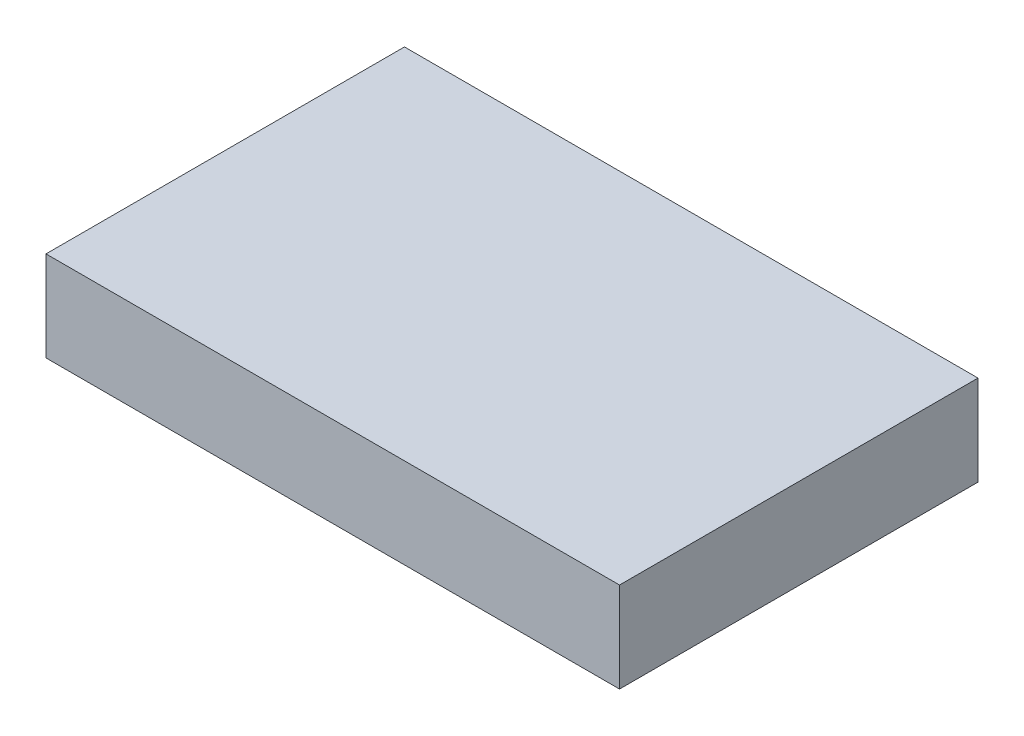
ISO-10303-21;
HEADER;
FILE_DESCRIPTION(('STEP AP214'),'2;1');
FILE_NAME('part.step','',(''),(''),'','','');
FILE_SCHEMA(('AUTOMOTIVE_DESIGN { 1 0 10303 214 1 1 1 1 }'));
ENDSEC;
DATA;
#1=APPLICATION_CONTEXT('core data for automotive mechanical design processes');
#2=APPLICATION_PROTOCOL_DEFINITION('international standard','automotive_design',2000,#1);
#3=PRODUCT_CONTEXT('',#1,'mechanical');
#4=PRODUCT('Part','Part','',(#3));
#5=PRODUCT_RELATED_PRODUCT_CATEGORY('part','',(#4));
#6=PRODUCT_DEFINITION_FORMATION('','',#4);
#7=PRODUCT_DEFINITION_CONTEXT('part definition',#1,'design');
#8=PRODUCT_DEFINITION('design','',#6,#7);
#9=PRODUCT_DEFINITION_SHAPE('','',#8);
#10=(LENGTH_UNIT() NAMED_UNIT(*) SI_UNIT(.MILLI.,.METRE.));
#11=(NAMED_UNIT(*) PLANE_ANGLE_UNIT() SI_UNIT($,.RADIAN.));
#12=(NAMED_UNIT(*) SI_UNIT($,.STERADIAN.) SOLID_ANGLE_UNIT());
#13=UNCERTAINTY_MEASURE_WITH_UNIT(LENGTH_MEASURE(1.E-05),#10,'distance_accuracy_value','');
#14=(GEOMETRIC_REPRESENTATION_CONTEXT(3) GLOBAL_UNCERTAINTY_ASSIGNED_CONTEXT((#13)) GLOBAL_UNIT_ASSIGNED_CONTEXT((#10,
#11,#12)) REPRESENTATION_CONTEXT('',''));
#15=CARTESIAN_POINT('',(0.,0.,0.));
#16=DIRECTION('',(0.,0.,1.));
#17=DIRECTION('',(1.,0.,0.));
#18=AXIS2_PLACEMENT_3D('',#15,#16,#17);
#19=CARTESIAN_POINT('',(140.,44.,87.5));
#20=DIRECTION('',(-1.,0.,0.));
#21=DIRECTION('',(0.,0.,1.));
#22=AXIS2_PLACEMENT_3D('',#19,#20,#21);
#23=PLANE('',#22);
#24=DIRECTION('',(0.,0.,-1.));
#25=VECTOR('',#24,1.);
#26=CARTESIAN_POINT('',(140.,0.,87.5));
#27=LINE('',#26,#25);
#28=CARTESIAN_POINT('',(140.,0.,87.5));
#29=VERTEX_POINT('',#28);
#30=CARTESIAN_POINT('',(140.,0.,-87.5));
#31=VERTEX_POINT('',#30);
#32=EDGE_CURVE('E95',#29,#31,#27,.T.);
#33=ORIENTED_EDGE('',*,*,#32,.T.);
#34=DIRECTION('',(0.,-1.,0.));
#35=VECTOR('',#34,1.);
#36=CARTESIAN_POINT('',(140.,44.,-87.5));
#37=LINE('',#36,#35);
#38=CARTESIAN_POINT('',(140.,44.,-87.5));
#39=VERTEX_POINT('',#38);
#40=EDGE_CURVE('E11',#39,#31,#37,.T.);
#41=ORIENTED_EDGE('',*,*,#40,.F.);
#42=DIRECTION('',(0.,0.,-1.));
#43=VECTOR('',#42,1.);
#44=CARTESIAN_POINT('',(140.,44.,87.5));
#45=LINE('',#44,#43);
#46=CARTESIAN_POINT('',(140.,44.,87.5));
#47=VERTEX_POINT('',#46);
#48=EDGE_CURVE('E83',#47,#39,#45,.T.);
#49=ORIENTED_EDGE('',*,*,#48,.F.);
#50=DIRECTION('',(0.,-1.,0.));
#51=VECTOR('',#50,1.);
#52=CARTESIAN_POINT('',(140.,44.,87.5));
#53=LINE('',#52,#51);
#54=EDGE_CURVE('E91',#47,#29,#53,.T.);
#55=ORIENTED_EDGE('',*,*,#54,.T.);
#56=EDGE_LOOP('',(#33,#41,#49,#55));
#57=FACE_BOUND('',#56,.T.);
#58=ADVANCED_FACE('F32',(#57),#23,.F.);
#59=CARTESIAN_POINT('',(-140.,44.,-87.5));
#60=DIRECTION('',(0.,0.,1.));
#61=DIRECTION('',(1.,0.,0.));
#62=AXIS2_PLACEMENT_3D('',#59,#60,#61);
#63=PLANE('',#62);
#64=DIRECTION('',(-1.,0.,0.));
#65=VECTOR('',#64,1.);
#66=CARTESIAN_POINT('',(-140.,0.,-87.5));
#67=LINE('',#66,#65);
#68=CARTESIAN_POINT('',(-140.,0.,-87.5));
#69=VERTEX_POINT('',#68);
#70=EDGE_CURVE('E87',#31,#69,#67,.T.);
#71=ORIENTED_EDGE('',*,*,#70,.T.);
#72=DIRECTION('',(0.,-1.,0.));
#73=VECTOR('',#72,1.);
#74=CARTESIAN_POINT('',(-140.,44.,-87.5));
#75=LINE('',#74,#73);
#76=CARTESIAN_POINT('',(-140.,44.,-87.5));
#77=VERTEX_POINT('',#76);
#78=EDGE_CURVE('E40',#77,#69,#75,.T.);
#79=ORIENTED_EDGE('',*,*,#78,.F.);
#80=DIRECTION('',(-1.,0.,0.));
#81=VECTOR('',#80,1.);
#82=CARTESIAN_POINT('',(-140.,44.,-87.5));
#83=LINE('',#82,#81);
#84=EDGE_CURVE('E78',#39,#77,#83,.T.);
#85=ORIENTED_EDGE('',*,*,#84,.F.);
#86=ORIENTED_EDGE('',*,*,#40,.T.);
#87=EDGE_LOOP('',(#71,#79,#85,#86));
#88=FACE_BOUND('',#87,.T.);
#89=ADVANCED_FACE('F86',(#88),#63,.F.);
#90=CARTESIAN_POINT('',(-140.,44.,87.5));
#91=DIRECTION('',(1.,0.,0.));
#92=DIRECTION('',(0.,0.,-1.));
#93=AXIS2_PLACEMENT_3D('',#90,#91,#92);
#94=PLANE('',#93);
#95=DIRECTION('',(0.,0.,1.));
#96=VECTOR('',#95,1.);
#97=CARTESIAN_POINT('',(-140.,0.,87.5));
#98=LINE('',#97,#96);
#99=CARTESIAN_POINT('',(-140.,0.,87.5));
#100=VERTEX_POINT('',#99);
#101=EDGE_CURVE('E65',#69,#100,#98,.T.);
#102=ORIENTED_EDGE('',*,*,#101,.T.);
#103=DIRECTION('',(0.,-1.,0.));
#104=VECTOR('',#103,1.);
#105=CARTESIAN_POINT('',(-140.,44.,87.5));
#106=LINE('',#105,#104);
#107=CARTESIAN_POINT('',(-140.,44.,87.5));
#108=VERTEX_POINT('',#107);
#109=EDGE_CURVE('E88',#108,#100,#106,.T.);
#110=ORIENTED_EDGE('',*,*,#109,.F.);
#111=DIRECTION('',(0.,0.,1.));
#112=VECTOR('',#111,1.);
#113=CARTESIAN_POINT('',(-140.,44.,87.5));
#114=LINE('',#113,#112);
#115=EDGE_CURVE('E81',#77,#108,#114,.T.);
#116=ORIENTED_EDGE('',*,*,#115,.F.);
#117=ORIENTED_EDGE('',*,*,#78,.T.);
#118=EDGE_LOOP('',(#102,#110,#116,#117));
#119=FACE_BOUND('',#118,.T.);
#120=ADVANCED_FACE('F89',(#119),#94,.F.);
#121=CARTESIAN_POINT('',(-140.,44.,87.5));
#122=DIRECTION('',(0.,0.,-1.));
#123=DIRECTION('',(-1.,0.,0.));
#124=AXIS2_PLACEMENT_3D('',#121,#122,#123);
#125=PLANE('',#124);
#126=DIRECTION('',(1.,0.,0.));
#127=VECTOR('',#126,1.);
#128=CARTESIAN_POINT('',(-140.,0.,87.5));
#129=LINE('',#128,#127);
#130=EDGE_CURVE('E71',#100,#29,#129,.T.);
#131=ORIENTED_EDGE('',*,*,#130,.T.);
#132=ORIENTED_EDGE('',*,*,#54,.F.);
#133=DIRECTION('',(1.,0.,0.));
#134=VECTOR('',#133,1.);
#135=CARTESIAN_POINT('',(-140.,44.,87.5));
#136=LINE('',#135,#134);
#137=EDGE_CURVE('E48',#108,#47,#136,.T.);
#138=ORIENTED_EDGE('',*,*,#137,.F.);
#139=ORIENTED_EDGE('',*,*,#109,.T.);
#140=EDGE_LOOP('',(#131,#132,#138,#139));
#141=FACE_BOUND('',#140,.T.);
#142=ADVANCED_FACE('F102',(#141),#125,.F.);
#143=CARTESIAN_POINT('',(0.,44.,0.));
#144=DIRECTION('',(0.,-1.,0.));
#145=DIRECTION('',(0.,0.,-1.));
#146=AXIS2_PLACEMENT_3D('',#143,#144,#145);
#147=PLANE('',#146);
#148=ORIENTED_EDGE('',*,*,#48,.T.);
#149=ORIENTED_EDGE('',*,*,#84,.T.);
#150=ORIENTED_EDGE('',*,*,#115,.T.);
#151=ORIENTED_EDGE('',*,*,#137,.T.);
#152=EDGE_LOOP('',(#148,#149,#150,#151));
#153=FACE_BOUND('',#152,.T.);
#154=ADVANCED_FACE('F79',(#153),#147,.F.);
#155=CARTESIAN_POINT('',(0.,0.,0.));
#156=DIRECTION('',(0.,-1.,0.));
#157=DIRECTION('',(0.,0.,-1.));
#158=AXIS2_PLACEMENT_3D('',#155,#156,#157);
#159=PLANE('',#158);
#160=ORIENTED_EDGE('',*,*,#32,.F.);
#161=ORIENTED_EDGE('',*,*,#130,.F.);
#162=ORIENTED_EDGE('',*,*,#101,.F.);
#163=ORIENTED_EDGE('',*,*,#70,.F.);
#164=EDGE_LOOP('',(#160,#161,#162,#163));
#165=FACE_BOUND('',#164,.T.);
#166=ADVANCED_FACE('F105',(#165),#159,.T.);
#167=CLOSED_SHELL('',(#58,#89,#120,#142,#154,#166));
#168=MANIFOLD_SOLID_BREP('B2',#167);
#169=ADVANCED_BREP_SHAPE_REPRESENTATION('',(#18,#168),#14);
#170=SHAPE_DEFINITION_REPRESENTATION(#9,#169);
ENDSEC;
END-ISO-10303-21;
